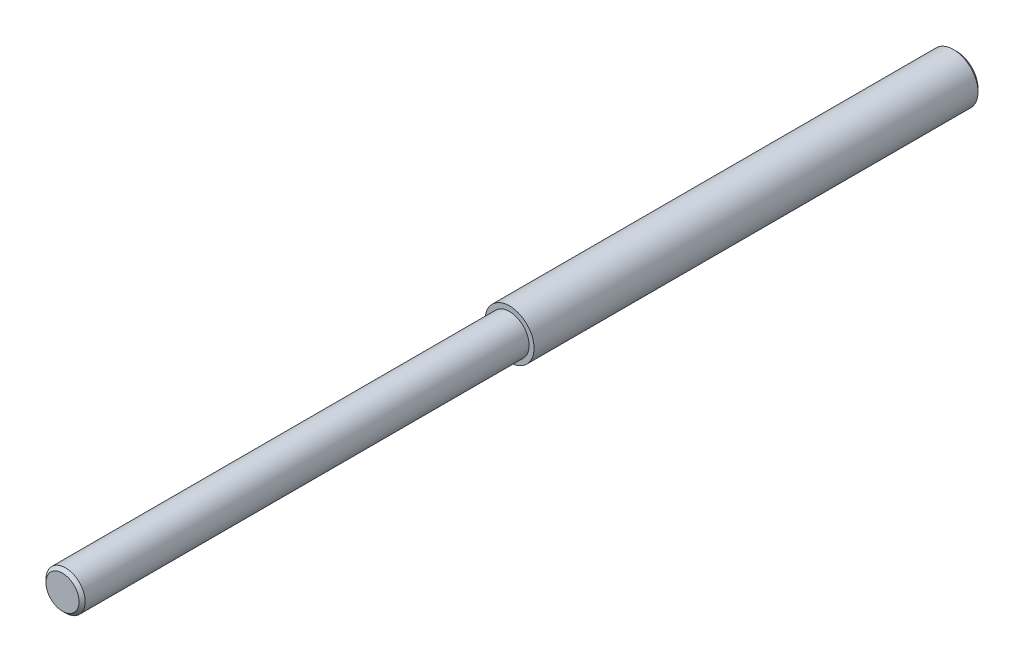
ISO-10303-21;
HEADER;
FILE_DESCRIPTION(('STEP AP214'),'2;1');
FILE_NAME('part.step','',(''),(''),'','','');
FILE_SCHEMA(('AUTOMOTIVE_DESIGN { 1 0 10303 214 1 1 1 1 }'));
ENDSEC;
DATA;
#1=APPLICATION_CONTEXT('core data for automotive mechanical design processes');
#2=APPLICATION_PROTOCOL_DEFINITION('international standard','automotive_design',2000,#1);
#3=PRODUCT_CONTEXT('',#1,'mechanical');
#4=PRODUCT('Part','Part','',(#3));
#5=PRODUCT_RELATED_PRODUCT_CATEGORY('part','',(#4));
#6=PRODUCT_DEFINITION_FORMATION('','',#4);
#7=PRODUCT_DEFINITION_CONTEXT('part definition',#1,'design');
#8=PRODUCT_DEFINITION('design','',#6,#7);
#9=PRODUCT_DEFINITION_SHAPE('','',#8);
#10=(LENGTH_UNIT() NAMED_UNIT(*) SI_UNIT(.MILLI.,.METRE.));
#11=(NAMED_UNIT(*) PLANE_ANGLE_UNIT() SI_UNIT($,.RADIAN.));
#12=(NAMED_UNIT(*) SI_UNIT($,.STERADIAN.) SOLID_ANGLE_UNIT());
#13=UNCERTAINTY_MEASURE_WITH_UNIT(LENGTH_MEASURE(1.E-05),#10,'distance_accuracy_value','');
#14=(GEOMETRIC_REPRESENTATION_CONTEXT(3) GLOBAL_UNCERTAINTY_ASSIGNED_CONTEXT((#13)) GLOBAL_UNIT_ASSIGNED_CONTEXT((#10,
#11,#12)) REPRESENTATION_CONTEXT('',''));
#15=CARTESIAN_POINT('',(0.,0.,0.));
#16=DIRECTION('',(0.,0.,1.));
#17=DIRECTION('',(1.,0.,0.));
#18=AXIS2_PLACEMENT_3D('',#15,#16,#17);
#19=CARTESIAN_POINT('',(0.,0.,73.));
#20=DIRECTION('',(0.,0.,-1.));
#21=DIRECTION('',(-1.,0.,0.));
#22=AXIS2_PLACEMENT_3D('',#19,#20,#21);
#23=CYLINDRICAL_SURFACE('',#22,4.);
#24=CARTESIAN_POINT('',(0.,0.,0.500000000000014));
#25=DIRECTION('',(0.,0.,1.));
#26=DIRECTION('',(1.,0.,0.));
#27=AXIS2_PLACEMENT_3D('',#24,#25,#26);
#28=CIRCLE('',#27,4.);
#29=CARTESIAN_POINT('',(4.,0.,0.500000000000014));
#30=VERTEX_POINT('',#29);
#31=EDGE_CURVE('E38',#30,#30,#28,.T.);
#32=ORIENTED_EDGE('',*,*,#31,.T.);
#33=EDGE_LOOP('',(#32));
#34=FACE_BOUND('',#33,.T.);
#35=CARTESIAN_POINT('',(0.,0.,73.));
#36=DIRECTION('',(0.,0.,1.));
#37=DIRECTION('',(1.,0.,0.));
#38=AXIS2_PLACEMENT_3D('',#35,#36,#37);
#39=CIRCLE('',#38,4.);
#40=CARTESIAN_POINT('',(4.,0.,73.));
#41=VERTEX_POINT('',#40);
#42=EDGE_CURVE('E51',#41,#41,#39,.T.);
#43=ORIENTED_EDGE('',*,*,#42,.F.);
#44=EDGE_LOOP('',(#43));
#45=FACE_BOUND('',#44,.T.);
#46=ADVANCED_FACE('F31',(#34,#45),#23,.T.);
#47=CARTESIAN_POINT('',(0.,0.,73.));
#48=DIRECTION('',(0.,0.,1.));
#49=DIRECTION('',(1.,0.,0.));
#50=AXIS2_PLACEMENT_3D('',#47,#48,#49);
#51=PLANE('',#50);
#52=CARTESIAN_POINT('',(0.,0.,73.));
#53=DIRECTION('',(0.,0.,1.));
#54=DIRECTION('',(1.,0.,0.));
#55=AXIS2_PLACEMENT_3D('',#52,#53,#54);
#56=CIRCLE('',#55,3.2);
#57=CARTESIAN_POINT('',(3.2,0.,73.));
#58=VERTEX_POINT('',#57);
#59=EDGE_CURVE('E54',#58,#58,#56,.T.);
#60=ORIENTED_EDGE('',*,*,#59,.F.);
#61=EDGE_LOOP('',(#60));
#62=FACE_BOUND('',#61,.T.);
#63=ORIENTED_EDGE('',*,*,#42,.T.);
#64=EDGE_LOOP('',(#63));
#65=FACE_BOUND('',#64,.T.);
#66=ADVANCED_FACE('F60',(#62,#65),#51,.T.);
#67=CARTESIAN_POINT('',(0.,0.,0.));
#68=DIRECTION('',(0.,0.,1.));
#69=DIRECTION('',(1.,0.,0.));
#70=AXIS2_PLACEMENT_3D('',#67,#68,#69);
#71=PLANE('',#70);
#72=CARTESIAN_POINT('',(0.,0.,0.));
#73=DIRECTION('',(0.,0.,1.));
#74=DIRECTION('',(1.,0.,0.));
#75=AXIS2_PLACEMENT_3D('',#72,#73,#74);
#76=CIRCLE('',#75,3.5);
#77=CARTESIAN_POINT('',(3.5,0.,0.));
#78=VERTEX_POINT('',#77);
#79=EDGE_CURVE('E10',#78,#78,#76,.F.);
#80=ORIENTED_EDGE('',*,*,#79,.T.);
#81=EDGE_LOOP('',(#80));
#82=FACE_BOUND('',#81,.T.);
#83=ADVANCED_FACE('F63',(#82),#71,.F.);
#84=CARTESIAN_POINT('',(0.,0.,146.));
#85=DIRECTION('',(0.,0.,-1.));
#86=DIRECTION('',(-1.,0.,0.));
#87=AXIS2_PLACEMENT_3D('',#84,#85,#86);
#88=CYLINDRICAL_SURFACE('',#87,3.2);
#89=CARTESIAN_POINT('',(0.,0.,145.5));
#90=DIRECTION('',(0.,0.,1.));
#91=DIRECTION('',(1.,0.,0.));
#92=AXIS2_PLACEMENT_3D('',#89,#90,#91);
#93=CIRCLE('',#92,3.2);
#94=CARTESIAN_POINT('',(3.2,0.,145.5));
#95=VERTEX_POINT('',#94);
#96=EDGE_CURVE('E42',#95,#95,#93,.F.);
#97=ORIENTED_EDGE('',*,*,#96,.T.);
#98=EDGE_LOOP('',(#97));
#99=FACE_BOUND('',#98,.T.);
#100=ORIENTED_EDGE('',*,*,#59,.T.);
#101=EDGE_LOOP('',(#100));
#102=FACE_BOUND('',#101,.T.);
#103=ADVANCED_FACE('F58',(#99,#102),#88,.T.);
#104=CARTESIAN_POINT('',(0.,0.,146.));
#105=DIRECTION('',(0.,0.,1.));
#106=DIRECTION('',(1.,0.,0.));
#107=AXIS2_PLACEMENT_3D('',#104,#105,#106);
#108=PLANE('',#107);
#109=CARTESIAN_POINT('',(0.,0.,146.));
#110=DIRECTION('',(0.,0.,1.));
#111=DIRECTION('',(1.,0.,0.));
#112=AXIS2_PLACEMENT_3D('',#109,#110,#111);
#113=CIRCLE('',#112,2.69999999999999);
#114=CARTESIAN_POINT('',(2.69999999999999,0.,146.));
#115=VERTEX_POINT('',#114);
#116=EDGE_CURVE('E46',#115,#115,#113,.T.);
#117=ORIENTED_EDGE('',*,*,#116,.T.);
#118=EDGE_LOOP('',(#117));
#119=FACE_BOUND('',#118,.T.);
#120=ADVANCED_FACE('F76',(#119),#108,.T.);
#121=CARTESIAN_POINT('',(0.,0.,146.));
#122=DIRECTION('',(0.,0.,-1.));
#123=DIRECTION('',(-1.,0.,0.));
#124=AXIS2_PLACEMENT_3D('',#121,#122,#123);
#125=CONICAL_SURFACE('',#124,2.69999999999999,0.785398163397454);
#126=ORIENTED_EDGE('',*,*,#96,.F.);
#127=EDGE_LOOP('',(#126));
#128=FACE_BOUND('',#127,.T.);
#129=ORIENTED_EDGE('',*,*,#116,.F.);
#130=EDGE_LOOP('',(#129));
#131=FACE_BOUND('',#130,.T.);
#132=ADVANCED_FACE('F74',(#128,#131),#125,.T.);
#133=CARTESIAN_POINT('',(0.,0.,0.500000000000014));
#134=DIRECTION('',(0.,0.,1.));
#135=DIRECTION('',(1.,0.,0.));
#136=AXIS2_PLACEMENT_3D('',#133,#134,#135);
#137=CONICAL_SURFACE('',#136,4.,0.785398163397431);
#138=ORIENTED_EDGE('',*,*,#79,.F.);
#139=EDGE_LOOP('',(#138));
#140=FACE_BOUND('',#139,.T.);
#141=ORIENTED_EDGE('',*,*,#31,.F.);
#142=EDGE_LOOP('',(#141));
#143=FACE_BOUND('',#142,.T.);
#144=ADVANCED_FACE('F33',(#140,#143),#137,.T.);
#145=CLOSED_SHELL('',(#46,#66,#83,#103,#120,#132,#144));
#146=MANIFOLD_SOLID_BREP('B2',#145);
#147=ADVANCED_BREP_SHAPE_REPRESENTATION('',(#18,#146),#14);
#148=SHAPE_DEFINITION_REPRESENTATION(#9,#147);
ENDSEC;
END-ISO-10303-21;
